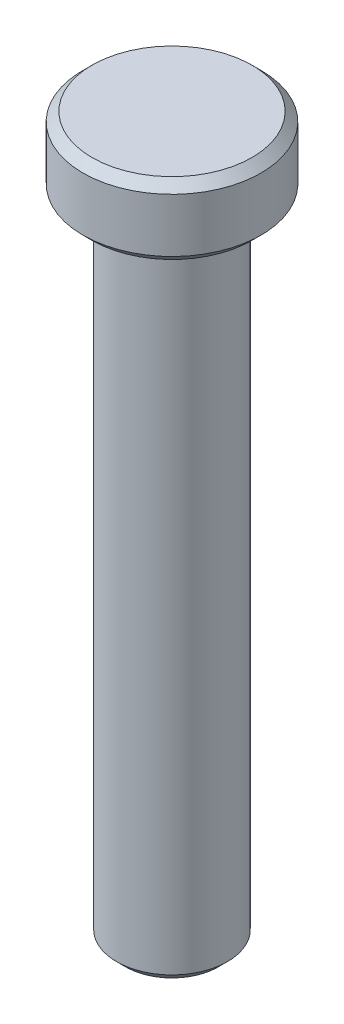
ISO-10303-21;
HEADER;
FILE_DESCRIPTION(('STEP AP214'),'2;1');
FILE_NAME('part.step','',(''),(''),'','','');
FILE_SCHEMA(('AUTOMOTIVE_DESIGN { 1 0 10303 214 1 1 1 1 }'));
ENDSEC;
DATA;
#1=APPLICATION_CONTEXT('core data for automotive mechanical design processes');
#2=APPLICATION_PROTOCOL_DEFINITION('international standard','automotive_design',2000,#1);
#3=PRODUCT_CONTEXT('',#1,'mechanical');
#4=PRODUCT('Part','Part','',(#3));
#5=PRODUCT_RELATED_PRODUCT_CATEGORY('part','',(#4));
#6=PRODUCT_DEFINITION_FORMATION('','',#4);
#7=PRODUCT_DEFINITION_CONTEXT('part definition',#1,'design');
#8=PRODUCT_DEFINITION('design','',#6,#7);
#9=PRODUCT_DEFINITION_SHAPE('','',#8);
#10=(LENGTH_UNIT() NAMED_UNIT(*) SI_UNIT(.MILLI.,.METRE.));
#11=(NAMED_UNIT(*) PLANE_ANGLE_UNIT() SI_UNIT($,.RADIAN.));
#12=(NAMED_UNIT(*) SI_UNIT($,.STERADIAN.) SOLID_ANGLE_UNIT());
#13=UNCERTAINTY_MEASURE_WITH_UNIT(LENGTH_MEASURE(1.E-05),#10,'distance_accuracy_value','');
#14=(GEOMETRIC_REPRESENTATION_CONTEXT(3) GLOBAL_UNCERTAINTY_ASSIGNED_CONTEXT((#13)) GLOBAL_UNIT_ASSIGNED_CONTEXT((#10,
#11,#12)) REPRESENTATION_CONTEXT('',''));
#15=CARTESIAN_POINT('',(0.,0.,0.));
#16=DIRECTION('',(0.,0.,1.));
#17=DIRECTION('',(1.,0.,0.));
#18=AXIS2_PLACEMENT_3D('',#15,#16,#17);
#19=CARTESIAN_POINT('',(0.,1.5875,0.));
#20=DIRECTION('',(0.,-1.,0.));
#21=DIRECTION('',(0.,0.,-1.));
#22=AXIS2_PLACEMENT_3D('',#19,#20,#21);
#23=CYLINDRICAL_SURFACE('',#22,3.937);
#24=CARTESIAN_POINT('',(0.,1.19062499999999,0.));
#25=DIRECTION('',(0.,1.,0.));
#26=DIRECTION('',(0.,0.,1.));
#27=AXIS2_PLACEMENT_3D('',#24,#25,#26);
#28=CIRCLE('',#27,3.937);
#29=CARTESIAN_POINT('',(0.,1.19062499999999,3.937));
#30=VERTEX_POINT('',#29);
#31=EDGE_CURVE('E45',#30,#30,#28,.F.);
#32=ORIENTED_EDGE('',*,*,#31,.T.);
#33=EDGE_LOOP('',(#32));
#34=FACE_BOUND('',#33,.T.);
#35=CARTESIAN_POINT('',(0.,-1.190625,0.));
#36=DIRECTION('',(0.,1.,0.));
#37=DIRECTION('',(0.,0.,1.));
#38=AXIS2_PLACEMENT_3D('',#35,#36,#37);
#39=CIRCLE('',#38,3.937);
#40=CARTESIAN_POINT('',(0.,-1.190625,3.937));
#41=VERTEX_POINT('',#40);
#42=EDGE_CURVE('E50',#41,#41,#39,.T.);
#43=ORIENTED_EDGE('',*,*,#42,.T.);
#44=EDGE_LOOP('',(#43));
#45=FACE_BOUND('',#44,.T.);
#46=ADVANCED_FACE('F37',(#34,#45),#23,.T.);
#47=CARTESIAN_POINT('',(0.,1.5875,0.));
#48=DIRECTION('',(0.,1.,0.));
#49=DIRECTION('',(0.,0.,1.));
#50=AXIS2_PLACEMENT_3D('',#47,#48,#49);
#51=PLANE('',#50);
#52=CARTESIAN_POINT('',(0.,1.5875,0.));
#53=DIRECTION('',(0.,1.,0.));
#54=DIRECTION('',(0.,0.,1.));
#55=AXIS2_PLACEMENT_3D('',#52,#53,#54);
#56=CIRCLE('',#55,3.54012499999999);
#57=CARTESIAN_POINT('',(0.,1.5875,3.54012499999999));
#58=VERTEX_POINT('',#57);
#59=EDGE_CURVE('E55',#58,#58,#56,.T.);
#60=ORIENTED_EDGE('',*,*,#59,.T.);
#61=EDGE_LOOP('',(#60));
#62=FACE_BOUND('',#61,.T.);
#63=ADVANCED_FACE('F78',(#62),#51,.T.);
#64=CARTESIAN_POINT('',(0.,-1.5875,0.));
#65=DIRECTION('',(0.,1.,0.));
#66=DIRECTION('',(0.,0.,1.));
#67=AXIS2_PLACEMENT_3D('',#64,#65,#66);
#68=PLANE('',#67);
#69=CARTESIAN_POINT('',(0.,-1.5875,0.));
#70=DIRECTION('',(0.,1.,0.));
#71=DIRECTION('',(0.,0.,1.));
#72=AXIS2_PLACEMENT_3D('',#69,#70,#71);
#73=CIRCLE('',#72,3.540125);
#74=CARTESIAN_POINT('',(0.,-1.5875,3.540125));
#75=VERTEX_POINT('',#74);
#76=EDGE_CURVE('E10',#75,#75,#73,.F.);
#77=ORIENTED_EDGE('',*,*,#76,.T.);
#78=EDGE_LOOP('',(#77));
#79=FACE_BOUND('',#78,.T.);
#80=CARTESIAN_POINT('',(0.,-1.5875,0.));
#81=DIRECTION('',(0.,-1.,0.));
#82=DIRECTION('',(0.,0.,-1.));
#83=AXIS2_PLACEMENT_3D('',#80,#81,#82);
#84=CIRCLE('',#83,2.4511);
#85=CARTESIAN_POINT('',(0.,-1.5875,-2.4511));
#86=VERTEX_POINT('',#85);
#87=EDGE_CURVE('E69',#86,#86,#84,.T.);
#88=ORIENTED_EDGE('',*,*,#87,.F.);
#89=EDGE_LOOP('',(#88));
#90=FACE_BOUND('',#89,.T.);
#91=ADVANCED_FACE('F76',(#79,#90),#68,.F.);
#92=CARTESIAN_POINT('',(0.,-30.1625,0.));
#93=DIRECTION('',(0.,1.,0.));
#94=DIRECTION('',(0.,0.,1.));
#95=AXIS2_PLACEMENT_3D('',#92,#93,#94);
#96=CYLINDRICAL_SURFACE('',#95,2.4511);
#97=CARTESIAN_POINT('',(0.,-29.765625,0.));
#98=DIRECTION('',(0.,-1.,0.));
#99=DIRECTION('',(0.,0.,-1.));
#100=AXIS2_PLACEMENT_3D('',#97,#98,#99);
#101=CIRCLE('',#100,2.4511);
#102=CARTESIAN_POINT('',(0.,-29.765625,-2.4511));
#103=VERTEX_POINT('',#102);
#104=EDGE_CURVE('E61',#103,#103,#101,.F.);
#105=ORIENTED_EDGE('',*,*,#104,.T.);
#106=EDGE_LOOP('',(#105));
#107=FACE_BOUND('',#106,.T.);
#108=ORIENTED_EDGE('',*,*,#87,.T.);
#109=EDGE_LOOP('',(#108));
#110=FACE_BOUND('',#109,.T.);
#111=ADVANCED_FACE('F74',(#107,#110),#96,.T.);
#112=CARTESIAN_POINT('',(0.,-30.1625,0.));
#113=DIRECTION('',(0.,-1.,0.));
#114=DIRECTION('',(0.,0.,-1.));
#115=AXIS2_PLACEMENT_3D('',#112,#113,#114);
#116=PLANE('',#115);
#117=CARTESIAN_POINT('',(0.,-30.1625,0.));
#118=DIRECTION('',(0.,-1.,0.));
#119=DIRECTION('',(0.,0.,-1.));
#120=AXIS2_PLACEMENT_3D('',#117,#118,#119);
#121=CIRCLE('',#120,2.054225);
#122=CARTESIAN_POINT('',(0.,-30.1625,-2.054225));
#123=VERTEX_POINT('',#122);
#124=EDGE_CURVE('E65',#123,#123,#121,.T.);
#125=ORIENTED_EDGE('',*,*,#124,.T.);
#126=EDGE_LOOP('',(#125));
#127=FACE_BOUND('',#126,.T.);
#128=ADVANCED_FACE('F84',(#127),#116,.T.);
#129=CARTESIAN_POINT('',(0.,-30.1625,0.));
#130=DIRECTION('',(0.,1.,0.));
#131=DIRECTION('',(0.,0.,1.));
#132=AXIS2_PLACEMENT_3D('',#129,#130,#131);
#133=CONICAL_SURFACE('',#132,2.054225,0.785398163397447);
#134=ORIENTED_EDGE('',*,*,#104,.F.);
#135=EDGE_LOOP('',(#134));
#136=FACE_BOUND('',#135,.T.);
#137=ORIENTED_EDGE('',*,*,#124,.F.);
#138=EDGE_LOOP('',(#137));
#139=FACE_BOUND('',#138,.T.);
#140=ADVANCED_FACE('F95',(#136,#139),#133,.T.);
#141=CARTESIAN_POINT('',(0.,1.5875,0.));
#142=DIRECTION('',(0.,-1.,0.));
#143=DIRECTION('',(0.,0.,-1.));
#144=AXIS2_PLACEMENT_3D('',#141,#142,#143);
#145=CONICAL_SURFACE('',#144,3.54012499999999,0.78539816339744);
#146=ORIENTED_EDGE('',*,*,#31,.F.);
#147=EDGE_LOOP('',(#146));
#148=FACE_BOUND('',#147,.T.);
#149=ORIENTED_EDGE('',*,*,#59,.F.);
#150=EDGE_LOOP('',(#149));
#151=FACE_BOUND('',#150,.T.);
#152=ADVANCED_FACE('F97',(#148,#151),#145,.T.);
#153=CARTESIAN_POINT('',(0.,-1.190625,0.));
#154=DIRECTION('',(0.,1.,0.));
#155=DIRECTION('',(0.,0.,1.));
#156=AXIS2_PLACEMENT_3D('',#153,#154,#155);
#157=CONICAL_SURFACE('',#156,3.937,0.785398163397446);
#158=ORIENTED_EDGE('',*,*,#76,.F.);
#159=EDGE_LOOP('',(#158));
#160=FACE_BOUND('',#159,.T.);
#161=ORIENTED_EDGE('',*,*,#42,.F.);
#162=EDGE_LOOP('',(#161));
#163=FACE_BOUND('',#162,.T.);
#164=ADVANCED_FACE('F39',(#160,#163),#157,.T.);
#165=CLOSED_SHELL('',(#46,#63,#91,#111,#128,#140,#152,#164));
#166=MANIFOLD_SOLID_BREP('B2',#165);
#167=ADVANCED_BREP_SHAPE_REPRESENTATION('',(#18,#166),#14);
#168=SHAPE_DEFINITION_REPRESENTATION(#9,#167);
ENDSEC;
END-ISO-10303-21;
